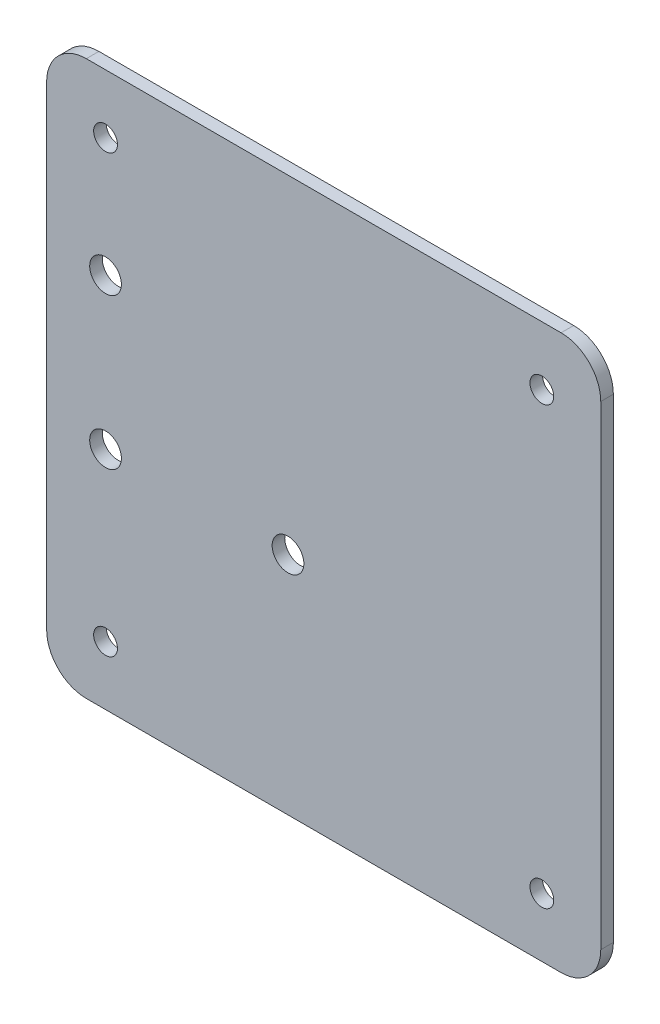
ISO-10303-21;
HEADER;
FILE_DESCRIPTION(('STEP AP214'),'2;1');
FILE_NAME('part.step','',(''),(''),'','','');
FILE_SCHEMA(('AUTOMOTIVE_DESIGN { 1 0 10303 214 1 1 1 1 }'));
ENDSEC;
DATA;
#1=APPLICATION_CONTEXT('core data for automotive mechanical design processes');
#2=APPLICATION_PROTOCOL_DEFINITION('international standard','automotive_design',2000,#1);
#3=PRODUCT_CONTEXT('',#1,'mechanical');
#4=PRODUCT('Part','Part','',(#3));
#5=PRODUCT_RELATED_PRODUCT_CATEGORY('part','',(#4));
#6=PRODUCT_DEFINITION_FORMATION('','',#4);
#7=PRODUCT_DEFINITION_CONTEXT('part definition',#1,'design');
#8=PRODUCT_DEFINITION('design','',#6,#7);
#9=PRODUCT_DEFINITION_SHAPE('','',#8);
#10=(LENGTH_UNIT() NAMED_UNIT(*) SI_UNIT(.MILLI.,.METRE.));
#11=(NAMED_UNIT(*) PLANE_ANGLE_UNIT() SI_UNIT($,.RADIAN.));
#12=(NAMED_UNIT(*) SI_UNIT($,.STERADIAN.) SOLID_ANGLE_UNIT());
#13=UNCERTAINTY_MEASURE_WITH_UNIT(LENGTH_MEASURE(1.E-05),#10,'distance_accuracy_value','');
#14=(GEOMETRIC_REPRESENTATION_CONTEXT(3) GLOBAL_UNCERTAINTY_ASSIGNED_CONTEXT((#13)) GLOBAL_UNIT_ASSIGNED_CONTEXT((#10,
#11,#12)) REPRESENTATION_CONTEXT('',''));
#15=CARTESIAN_POINT('',(0.,0.,0.));
#16=DIRECTION('',(0.,0.,1.));
#17=DIRECTION('',(1.,0.,0.));
#18=AXIS2_PLACEMENT_3D('',#15,#16,#17);
#19=CARTESIAN_POINT('',(66.6352687811831,1591.86,3.175));
#20=DIRECTION('',(0.,0.,-1.));
#21=DIRECTION('',(-1.,0.,0.));
#22=AXIS2_PLACEMENT_3D('',#19,#20,#21);
#23=CYLINDRICAL_SURFACE('',#22,10.);
#24=CARTESIAN_POINT('',(66.6352687811831,1591.86,0.));
#25=DIRECTION('',(0.,0.,1.));
#26=DIRECTION('',(1.,0.,0.));
#27=AXIS2_PLACEMENT_3D('',#24,#25,#26);
#28=CIRCLE('',#27,10.);
#29=CARTESIAN_POINT('',(56.6352687811831,1591.86,0.));
#30=VERTEX_POINT('',#29);
#31=CARTESIAN_POINT('',(66.6352687811831,1581.86,0.));
#32=VERTEX_POINT('',#31);
#33=EDGE_CURVE('E149',#30,#32,#28,.T.);
#34=ORIENTED_EDGE('',*,*,#33,.T.);
#35=DIRECTION('',(0.,0.,-1.));
#36=VECTOR('',#35,1.);
#37=CARTESIAN_POINT('',(66.6352687811831,1581.86,3.175));
#38=LINE('',#37,#36);
#39=CARTESIAN_POINT('',(66.6352687811831,1581.86,3.175));
#40=VERTEX_POINT('',#39);
#41=EDGE_CURVE('E11',#40,#32,#38,.T.);
#42=ORIENTED_EDGE('',*,*,#41,.F.);
#43=CARTESIAN_POINT('',(66.6352687811831,1591.86,3.175));
#44=DIRECTION('',(0.,0.,1.));
#45=DIRECTION('',(1.,0.,0.));
#46=AXIS2_PLACEMENT_3D('',#43,#44,#45);
#47=CIRCLE('',#46,10.);
#48=CARTESIAN_POINT('',(56.6352687811831,1591.86,3.175));
#49=VERTEX_POINT('',#48);
#50=EDGE_CURVE('E170',#49,#40,#47,.T.);
#51=ORIENTED_EDGE('',*,*,#50,.F.);
#52=DIRECTION('',(0.,0.,-1.));
#53=VECTOR('',#52,1.);
#54=CARTESIAN_POINT('',(56.6352687811831,1591.86,3.175));
#55=LINE('',#54,#53);
#56=EDGE_CURVE('E145',#49,#30,#55,.T.);
#57=ORIENTED_EDGE('',*,*,#56,.T.);
#58=EDGE_LOOP('',(#34,#42,#51,#57));
#59=FACE_BOUND('',#58,.T.);
#60=ADVANCED_FACE('F43',(#59),#23,.T.);
#61=CARTESIAN_POINT('',(66.6352687811831,1581.86,3.175));
#62=DIRECTION('',(0.,1.,0.));
#63=DIRECTION('',(0.,0.,1.));
#64=AXIS2_PLACEMENT_3D('',#61,#62,#63);
#65=PLANE('',#64);
#66=DIRECTION('',(1.,0.,0.));
#67=VECTOR('',#66,1.);
#68=CARTESIAN_POINT('',(66.6352687811831,1581.86,0.));
#69=LINE('',#68,#67);
#70=CARTESIAN_POINT('',(186.335268781183,1581.86,0.));
#71=VERTEX_POINT('',#70);
#72=EDGE_CURVE('E152',#32,#71,#69,.T.);
#73=ORIENTED_EDGE('',*,*,#72,.T.);
#74=DIRECTION('',(0.,0.,-1.));
#75=VECTOR('',#74,1.);
#76=CARTESIAN_POINT('',(186.335268781183,1581.86,3.175));
#77=LINE('',#76,#75);
#78=CARTESIAN_POINT('',(186.335268781183,1581.86,3.175));
#79=VERTEX_POINT('',#78);
#80=EDGE_CURVE('E51',#79,#71,#77,.T.);
#81=ORIENTED_EDGE('',*,*,#80,.F.);
#82=DIRECTION('',(1.,0.,0.));
#83=VECTOR('',#82,1.);
#84=CARTESIAN_POINT('',(66.6352687811831,1581.86,3.175));
#85=LINE('',#84,#83);
#86=EDGE_CURVE('E106',#40,#79,#85,.T.);
#87=ORIENTED_EDGE('',*,*,#86,.F.);
#88=ORIENTED_EDGE('',*,*,#41,.T.);
#89=EDGE_LOOP('',(#73,#81,#87,#88));
#90=FACE_BOUND('',#89,.T.);
#91=ADVANCED_FACE('F289',(#90),#65,.F.);
#92=CARTESIAN_POINT('',(186.335268781183,1591.86,3.175));
#93=DIRECTION('',(0.,0.,-1.));
#94=DIRECTION('',(-1.,0.,0.));
#95=AXIS2_PLACEMENT_3D('',#92,#93,#94);
#96=CYLINDRICAL_SURFACE('',#95,10.);
#97=CARTESIAN_POINT('',(186.335268781183,1591.86,0.));
#98=DIRECTION('',(0.,0.,1.));
#99=DIRECTION('',(1.,0.,0.));
#100=AXIS2_PLACEMENT_3D('',#97,#98,#99);
#101=CIRCLE('',#100,10.);
#102=CARTESIAN_POINT('',(196.335268781183,1591.86,0.));
#103=VERTEX_POINT('',#102);
#104=EDGE_CURVE('E156',#71,#103,#101,.T.);
#105=ORIENTED_EDGE('',*,*,#104,.T.);
#106=DIRECTION('',(0.,0.,-1.));
#107=VECTOR('',#106,1.);
#108=CARTESIAN_POINT('',(196.335268781183,1591.86,3.175));
#109=LINE('',#108,#107);
#110=CARTESIAN_POINT('',(196.335268781183,1591.86,3.175));
#111=VERTEX_POINT('',#110);
#112=EDGE_CURVE('E179',#111,#103,#109,.T.);
#113=ORIENTED_EDGE('',*,*,#112,.F.);
#114=CARTESIAN_POINT('',(186.335268781183,1591.86,3.175));
#115=DIRECTION('',(0.,0.,1.));
#116=DIRECTION('',(1.,0.,0.));
#117=AXIS2_PLACEMENT_3D('',#114,#115,#116);
#118=CIRCLE('',#117,10.);
#119=EDGE_CURVE('E190',#79,#111,#118,.T.);
#120=ORIENTED_EDGE('',*,*,#119,.F.);
#121=ORIENTED_EDGE('',*,*,#80,.T.);
#122=EDGE_LOOP('',(#105,#113,#120,#121));
#123=FACE_BOUND('',#122,.T.);
#124=ADVANCED_FACE('F188',(#123),#96,.T.);
#125=CARTESIAN_POINT('',(196.335268781183,1711.56,3.175));
#126=DIRECTION('',(-1.,0.,0.));
#127=DIRECTION('',(0.,-1.,0.));
#128=AXIS2_PLACEMENT_3D('',#125,#126,#127);
#129=PLANE('',#128);
#130=DIRECTION('',(0.,1.,0.));
#131=VECTOR('',#130,1.);
#132=CARTESIAN_POINT('',(196.335268781183,1711.56,0.));
#133=LINE('',#132,#131);
#134=CARTESIAN_POINT('',(196.335268781183,1711.56,0.));
#135=VERTEX_POINT('',#134);
#136=EDGE_CURVE('E159',#103,#135,#133,.T.);
#137=ORIENTED_EDGE('',*,*,#136,.T.);
#138=DIRECTION('',(0.,0.,-1.));
#139=VECTOR('',#138,1.);
#140=CARTESIAN_POINT('',(196.335268781183,1711.56,3.175));
#141=LINE('',#140,#139);
#142=CARTESIAN_POINT('',(196.335268781183,1711.56,3.175));
#143=VERTEX_POINT('',#142);
#144=EDGE_CURVE('E175',#143,#135,#141,.T.);
#145=ORIENTED_EDGE('',*,*,#144,.F.);
#146=DIRECTION('',(0.,1.,0.));
#147=VECTOR('',#146,1.);
#148=CARTESIAN_POINT('',(196.335268781183,1711.56,3.175));
#149=LINE('',#148,#147);
#150=EDGE_CURVE('E203',#111,#143,#149,.T.);
#151=ORIENTED_EDGE('',*,*,#150,.F.);
#152=ORIENTED_EDGE('',*,*,#112,.T.);
#153=EDGE_LOOP('',(#137,#145,#151,#152));
#154=FACE_BOUND('',#153,.T.);
#155=ADVANCED_FACE('F198',(#154),#129,.F.);
#156=CARTESIAN_POINT('',(186.335268781183,1711.56,3.175));
#157=DIRECTION('',(0.,0.,-1.));
#158=DIRECTION('',(-1.,0.,0.));
#159=AXIS2_PLACEMENT_3D('',#156,#157,#158);
#160=CYLINDRICAL_SURFACE('',#159,10.);
#161=CARTESIAN_POINT('',(186.335268781183,1711.56,0.));
#162=DIRECTION('',(0.,0.,1.));
#163=DIRECTION('',(-1.,0.,0.));
#164=AXIS2_PLACEMENT_3D('',#161,#162,#163);
#165=CIRCLE('',#164,10.);
#166=CARTESIAN_POINT('',(186.335268781183,1721.56,0.));
#167=VERTEX_POINT('',#166);
#168=EDGE_CURVE('E162',#135,#167,#165,.T.);
#169=ORIENTED_EDGE('',*,*,#168,.T.);
#170=DIRECTION('',(0.,0.,-1.));
#171=VECTOR('',#170,1.);
#172=CARTESIAN_POINT('',(186.335268781183,1721.56,3.175));
#173=LINE('',#172,#171);
#174=CARTESIAN_POINT('',(186.335268781183,1721.56,3.175));
#175=VERTEX_POINT('',#174);
#176=EDGE_CURVE('E139',#175,#167,#173,.T.);
#177=ORIENTED_EDGE('',*,*,#176,.F.);
#178=CARTESIAN_POINT('',(186.335268781183,1711.56,3.175));
#179=DIRECTION('',(0.,0.,1.));
#180=DIRECTION('',(-1.,0.,0.));
#181=AXIS2_PLACEMENT_3D('',#178,#179,#180);
#182=CIRCLE('',#181,10.);
#183=EDGE_CURVE('E129',#143,#175,#182,.T.);
#184=ORIENTED_EDGE('',*,*,#183,.F.);
#185=ORIENTED_EDGE('',*,*,#144,.T.);
#186=EDGE_LOOP('',(#169,#177,#184,#185));
#187=FACE_BOUND('',#186,.T.);
#188=ADVANCED_FACE('F201',(#187),#160,.T.);
#189=CARTESIAN_POINT('',(66.6352687811831,1721.56,3.175));
#190=DIRECTION('',(0.,-1.,0.));
#191=DIRECTION('',(0.,0.,-1.));
#192=AXIS2_PLACEMENT_3D('',#189,#190,#191);
#193=PLANE('',#192);
#194=DIRECTION('',(-1.,0.,0.));
#195=VECTOR('',#194,1.);
#196=CARTESIAN_POINT('',(66.6352687811831,1721.56,0.));
#197=LINE('',#196,#195);
#198=CARTESIAN_POINT('',(66.6352687811831,1721.56,0.));
#199=VERTEX_POINT('',#198);
#200=EDGE_CURVE('E138',#167,#199,#197,.T.);
#201=ORIENTED_EDGE('',*,*,#200,.T.);
#202=DIRECTION('',(0.,0.,-1.));
#203=VECTOR('',#202,1.);
#204=CARTESIAN_POINT('',(66.6352687811831,1721.56,3.175));
#205=LINE('',#204,#203);
#206=CARTESIAN_POINT('',(66.6352687811831,1721.56,3.175));
#207=VERTEX_POINT('',#206);
#208=EDGE_CURVE('E135',#207,#199,#205,.T.);
#209=ORIENTED_EDGE('',*,*,#208,.F.);
#210=DIRECTION('',(-1.,0.,0.));
#211=VECTOR('',#210,1.);
#212=CARTESIAN_POINT('',(66.6352687811831,1721.56,3.175));
#213=LINE('',#212,#211);
#214=EDGE_CURVE('E123',#175,#207,#213,.T.);
#215=ORIENTED_EDGE('',*,*,#214,.F.);
#216=ORIENTED_EDGE('',*,*,#176,.T.);
#217=EDGE_LOOP('',(#201,#209,#215,#216));
#218=FACE_BOUND('',#217,.T.);
#219=ADVANCED_FACE('F136',(#218),#193,.F.);
#220=CARTESIAN_POINT('',(66.6352687811831,1711.56,3.175));
#221=DIRECTION('',(0.,0.,-1.));
#222=DIRECTION('',(-1.,0.,0.));
#223=AXIS2_PLACEMENT_3D('',#220,#221,#222);
#224=CYLINDRICAL_SURFACE('',#223,9.99999999999999);
#225=CARTESIAN_POINT('',(66.6352687811831,1711.56,0.));
#226=DIRECTION('',(0.,0.,1.));
#227=DIRECTION('',(1.,0.,0.));
#228=AXIS2_PLACEMENT_3D('',#225,#226,#227);
#229=CIRCLE('',#228,9.99999999999999);
#230=CARTESIAN_POINT('',(56.6352687811831,1711.56,0.));
#231=VERTEX_POINT('',#230);
#232=EDGE_CURVE('E92',#199,#231,#229,.T.);
#233=ORIENTED_EDGE('',*,*,#232,.T.);
#234=DIRECTION('',(0.,0.,-1.));
#235=VECTOR('',#234,1.);
#236=CARTESIAN_POINT('',(56.6352687811831,1711.56,3.175));
#237=LINE('',#236,#235);
#238=CARTESIAN_POINT('',(56.6352687811831,1711.56,3.175));
#239=VERTEX_POINT('',#238);
#240=EDGE_CURVE('E140',#239,#231,#237,.T.);
#241=ORIENTED_EDGE('',*,*,#240,.F.);
#242=CARTESIAN_POINT('',(66.6352687811831,1711.56,3.175));
#243=DIRECTION('',(0.,0.,1.));
#244=DIRECTION('',(1.,0.,0.));
#245=AXIS2_PLACEMENT_3D('',#242,#243,#244);
#246=CIRCLE('',#245,9.99999999999999);
#247=EDGE_CURVE('E127',#207,#239,#246,.T.);
#248=ORIENTED_EDGE('',*,*,#247,.F.);
#249=ORIENTED_EDGE('',*,*,#208,.T.);
#250=EDGE_LOOP('',(#233,#241,#248,#249));
#251=FACE_BOUND('',#250,.T.);
#252=ADVANCED_FACE('F142',(#251),#224,.T.);
#253=CARTESIAN_POINT('',(56.6352687811831,1711.56,3.175));
#254=DIRECTION('',(1.,0.,0.));
#255=DIRECTION('',(0.,1.,0.));
#256=AXIS2_PLACEMENT_3D('',#253,#254,#255);
#257=PLANE('',#256);
#258=DIRECTION('',(0.,-1.,0.));
#259=VECTOR('',#258,1.);
#260=CARTESIAN_POINT('',(56.6352687811831,1711.56,0.));
#261=LINE('',#260,#259);
#262=EDGE_CURVE('E98',#231,#30,#261,.T.);
#263=ORIENTED_EDGE('',*,*,#262,.T.);
#264=ORIENTED_EDGE('',*,*,#56,.F.);
#265=DIRECTION('',(0.,-1.,0.));
#266=VECTOR('',#265,1.);
#267=CARTESIAN_POINT('',(56.6352687811831,1711.56,3.175));
#268=LINE('',#267,#266);
#269=EDGE_CURVE('E59',#239,#49,#268,.T.);
#270=ORIENTED_EDGE('',*,*,#269,.F.);
#271=ORIENTED_EDGE('',*,*,#240,.T.);
#272=EDGE_LOOP('',(#263,#264,#270,#271));
#273=FACE_BOUND('',#272,.T.);
#274=ADVANCED_FACE('F296',(#273),#257,.F.);
#275=CARTESIAN_POINT('',(66.6352687811831,1591.86,3.175));
#276=DIRECTION('',(0.,0.,1.));
#277=DIRECTION('',(1.,0.,0.));
#278=AXIS2_PLACEMENT_3D('',#275,#276,#277);
#279=PLANE('',#278);
#280=CARTESIAN_POINT('',(181.485268781183,1706.71,3.175));
#281=DIRECTION('',(0.,0.,-1.));
#282=DIRECTION('',(-1.,0.,0.));
#283=AXIS2_PLACEMENT_3D('',#280,#281,#282);
#284=CIRCLE('',#283,2.99999999999999);
#285=CARTESIAN_POINT('',(178.485268781183,1706.71,3.175));
#286=VERTEX_POINT('',#285);
#287=EDGE_CURVE('E242',#286,#286,#284,.T.);
#288=ORIENTED_EDGE('',*,*,#287,.T.);
#289=EDGE_LOOP('',(#288));
#290=FACE_BOUND('',#289,.T.);
#291=CARTESIAN_POINT('',(181.485268781183,1596.71,3.175));
#292=DIRECTION('',(0.,0.,-1.));
#293=DIRECTION('',(-1.,0.,0.));
#294=AXIS2_PLACEMENT_3D('',#291,#292,#293);
#295=CIRCLE('',#294,2.99999999999999);
#296=CARTESIAN_POINT('',(178.485268781183,1596.71,3.175));
#297=VERTEX_POINT('',#296);
#298=EDGE_CURVE('E235',#297,#297,#295,.T.);
#299=ORIENTED_EDGE('',*,*,#298,.T.);
#300=EDGE_LOOP('',(#299));
#301=FACE_BOUND('',#300,.T.);
#302=CARTESIAN_POINT('',(71.4852687811831,1596.71,3.175));
#303=DIRECTION('',(0.,0.,-1.));
#304=DIRECTION('',(-1.,0.,0.));
#305=AXIS2_PLACEMENT_3D('',#302,#303,#304);
#306=CIRCLE('',#305,3.00000000000001);
#307=CARTESIAN_POINT('',(68.4852687811831,1596.71,3.175));
#308=VERTEX_POINT('',#307);
#309=EDGE_CURVE('E227',#308,#308,#306,.T.);
#310=ORIENTED_EDGE('',*,*,#309,.T.);
#311=EDGE_LOOP('',(#310));
#312=FACE_BOUND('',#311,.T.);
#313=CARTESIAN_POINT('',(71.4852687811831,1638.71,3.175));
#314=DIRECTION('',(0.,0.,-1.));
#315=DIRECTION('',(-1.,0.,0.));
#316=AXIS2_PLACEMENT_3D('',#313,#314,#315);
#317=CIRCLE('',#316,4.00000000000001);
#318=CARTESIAN_POINT('',(67.4852687811831,1638.71,3.175));
#319=VERTEX_POINT('',#318);
#320=EDGE_CURVE('E218',#319,#319,#317,.T.);
#321=ORIENTED_EDGE('',*,*,#320,.T.);
#322=EDGE_LOOP('',(#321));
#323=FACE_BOUND('',#322,.T.);
#324=CARTESIAN_POINT('',(71.4852687811831,1676.71,3.175));
#325=DIRECTION('',(0.,0.,-1.));
#326=DIRECTION('',(-1.,0.,0.));
#327=AXIS2_PLACEMENT_3D('',#324,#325,#326);
#328=CIRCLE('',#327,4.00000000000001);
#329=CARTESIAN_POINT('',(67.4852687811831,1676.71,3.175));
#330=VERTEX_POINT('',#329);
#331=EDGE_CURVE('E257',#330,#330,#328,.T.);
#332=ORIENTED_EDGE('',*,*,#331,.T.);
#333=EDGE_LOOP('',(#332));
#334=FACE_BOUND('',#333,.T.);
#335=CARTESIAN_POINT('',(117.485268781183,1638.71,3.175));
#336=DIRECTION('',(0.,0.,-1.));
#337=DIRECTION('',(-1.,0.,0.));
#338=AXIS2_PLACEMENT_3D('',#335,#336,#337);
#339=CIRCLE('',#338,4.00000000000001);
#340=CARTESIAN_POINT('',(113.485268781183,1638.71,3.175));
#341=VERTEX_POINT('',#340);
#342=EDGE_CURVE('E249',#341,#341,#339,.T.);
#343=ORIENTED_EDGE('',*,*,#342,.T.);
#344=EDGE_LOOP('',(#343));
#345=FACE_BOUND('',#344,.T.);
#346=CARTESIAN_POINT('',(71.4852687811831,1706.71,3.175));
#347=DIRECTION('',(0.,0.,-1.));
#348=DIRECTION('',(-1.,0.,0.));
#349=AXIS2_PLACEMENT_3D('',#346,#347,#348);
#350=CIRCLE('',#349,3.00000000000001);
#351=CARTESIAN_POINT('',(68.4852687811831,1706.71,3.175));
#352=VERTEX_POINT('',#351);
#353=EDGE_CURVE('E153',#352,#352,#350,.T.);
#354=ORIENTED_EDGE('',*,*,#353,.T.);
#355=EDGE_LOOP('',(#354));
#356=FACE_BOUND('',#355,.T.);
#357=ORIENTED_EDGE('',*,*,#50,.T.);
#358=ORIENTED_EDGE('',*,*,#86,.T.);
#359=ORIENTED_EDGE('',*,*,#119,.T.);
#360=ORIENTED_EDGE('',*,*,#150,.T.);
#361=ORIENTED_EDGE('',*,*,#183,.T.);
#362=ORIENTED_EDGE('',*,*,#214,.T.);
#363=ORIENTED_EDGE('',*,*,#247,.T.);
#364=ORIENTED_EDGE('',*,*,#269,.T.);
#365=EDGE_LOOP('',(#357,#358,#359,#360,#361,#362,#363,#364));
#366=FACE_BOUND('',#365,.T.);
#367=ADVANCED_FACE('F125',(#290,#301,#312,#323,#334,#345,#356,#366),#279,.T.);
#368=CARTESIAN_POINT('',(66.6352687811831,1591.86,0.));
#369=DIRECTION('',(0.,0.,1.));
#370=DIRECTION('',(1.,0.,0.));
#371=AXIS2_PLACEMENT_3D('',#368,#369,#370);
#372=PLANE('',#371);
#373=CARTESIAN_POINT('',(181.485268781183,1706.71,0.));
#374=DIRECTION('',(0.,0.,-1.));
#375=DIRECTION('',(-1.,0.,0.));
#376=AXIS2_PLACEMENT_3D('',#373,#374,#375);
#377=CIRCLE('',#376,2.99999999999999);
#378=CARTESIAN_POINT('',(178.485268781183,1706.71,0.));
#379=VERTEX_POINT('',#378);
#380=EDGE_CURVE('E215',#379,#379,#377,.T.);
#381=ORIENTED_EDGE('',*,*,#380,.F.);
#382=EDGE_LOOP('',(#381));
#383=FACE_BOUND('',#382,.T.);
#384=CARTESIAN_POINT('',(181.485268781183,1596.71,0.));
#385=DIRECTION('',(0.,0.,-1.));
#386=DIRECTION('',(-1.,0.,0.));
#387=AXIS2_PLACEMENT_3D('',#384,#385,#386);
#388=CIRCLE('',#387,2.99999999999999);
#389=CARTESIAN_POINT('',(178.485268781183,1596.71,0.));
#390=VERTEX_POINT('',#389);
#391=EDGE_CURVE('E239',#390,#390,#388,.T.);
#392=ORIENTED_EDGE('',*,*,#391,.F.);
#393=EDGE_LOOP('',(#392));
#394=FACE_BOUND('',#393,.T.);
#395=CARTESIAN_POINT('',(71.4852687811831,1596.71,0.));
#396=DIRECTION('',(0.,0.,-1.));
#397=DIRECTION('',(-1.,0.,0.));
#398=AXIS2_PLACEMENT_3D('',#395,#396,#397);
#399=CIRCLE('',#398,3.00000000000001);
#400=CARTESIAN_POINT('',(68.4852687811831,1596.71,0.));
#401=VERTEX_POINT('',#400);
#402=EDGE_CURVE('E231',#401,#401,#399,.T.);
#403=ORIENTED_EDGE('',*,*,#402,.F.);
#404=EDGE_LOOP('',(#403));
#405=FACE_BOUND('',#404,.T.);
#406=CARTESIAN_POINT('',(71.4852687811831,1638.71,0.));
#407=DIRECTION('',(0.,0.,-1.));
#408=DIRECTION('',(-1.,0.,0.));
#409=AXIS2_PLACEMENT_3D('',#406,#407,#408);
#410=CIRCLE('',#409,4.00000000000001);
#411=CARTESIAN_POINT('',(67.4852687811831,1638.71,0.));
#412=VERTEX_POINT('',#411);
#413=EDGE_CURVE('E222',#412,#412,#410,.T.);
#414=ORIENTED_EDGE('',*,*,#413,.F.);
#415=EDGE_LOOP('',(#414));
#416=FACE_BOUND('',#415,.T.);
#417=CARTESIAN_POINT('',(71.4852687811831,1676.71,0.));
#418=DIRECTION('',(0.,0.,-1.));
#419=DIRECTION('',(-1.,0.,0.));
#420=AXIS2_PLACEMENT_3D('',#417,#418,#419);
#421=CIRCLE('',#420,4.00000000000001);
#422=CARTESIAN_POINT('',(67.4852687811831,1676.71,0.));
#423=VERTEX_POINT('',#422);
#424=EDGE_CURVE('E223',#423,#423,#421,.T.);
#425=ORIENTED_EDGE('',*,*,#424,.F.);
#426=EDGE_LOOP('',(#425));
#427=FACE_BOUND('',#426,.T.);
#428=CARTESIAN_POINT('',(117.485268781183,1638.71,0.));
#429=DIRECTION('',(0.,0.,-1.));
#430=DIRECTION('',(-1.,0.,0.));
#431=AXIS2_PLACEMENT_3D('',#428,#429,#430);
#432=CIRCLE('',#431,4.00000000000001);
#433=CARTESIAN_POINT('',(113.485268781183,1638.71,0.));
#434=VERTEX_POINT('',#433);
#435=EDGE_CURVE('E253',#434,#434,#432,.T.);
#436=ORIENTED_EDGE('',*,*,#435,.F.);
#437=EDGE_LOOP('',(#436));
#438=FACE_BOUND('',#437,.T.);
#439=CARTESIAN_POINT('',(71.4852687811831,1706.71,0.));
#440=DIRECTION('',(0.,0.,-1.));
#441=DIRECTION('',(-1.,0.,0.));
#442=AXIS2_PLACEMENT_3D('',#439,#440,#441);
#443=CIRCLE('',#442,3.00000000000001);
#444=CARTESIAN_POINT('',(68.4852687811831,1706.71,0.));
#445=VERTEX_POINT('',#444);
#446=EDGE_CURVE('E212',#445,#445,#443,.T.);
#447=ORIENTED_EDGE('',*,*,#446,.F.);
#448=EDGE_LOOP('',(#447));
#449=FACE_BOUND('',#448,.T.);
#450=ORIENTED_EDGE('',*,*,#33,.F.);
#451=ORIENTED_EDGE('',*,*,#262,.F.);
#452=ORIENTED_EDGE('',*,*,#232,.F.);
#453=ORIENTED_EDGE('',*,*,#200,.F.);
#454=ORIENTED_EDGE('',*,*,#168,.F.);
#455=ORIENTED_EDGE('',*,*,#136,.F.);
#456=ORIENTED_EDGE('',*,*,#104,.F.);
#457=ORIENTED_EDGE('',*,*,#72,.F.);
#458=EDGE_LOOP('',(#450,#451,#452,#453,#454,#455,#456,#457));
#459=FACE_BOUND('',#458,.T.);
#460=ADVANCED_FACE('F194',(#383,#394,#405,#416,#427,#438,#449,#459),#372,.F.);
#461=CARTESIAN_POINT('',(71.4852687811831,1706.71,3.175));
#462=DIRECTION('',(0.,0.,-1.));
#463=DIRECTION('',(-1.,0.,0.));
#464=AXIS2_PLACEMENT_3D('',#461,#462,#463);
#465=CYLINDRICAL_SURFACE('',#464,3.00000000000001);
#466=ORIENTED_EDGE('',*,*,#353,.F.);
#467=EDGE_LOOP('',(#466));
#468=FACE_BOUND('',#467,.T.);
#469=ORIENTED_EDGE('',*,*,#446,.T.);
#470=EDGE_LOOP('',(#469));
#471=FACE_BOUND('',#470,.T.);
#472=ADVANCED_FACE('F269',(#468,#471),#465,.F.);
#473=CARTESIAN_POINT('',(117.485268781183,1638.71,3.175));
#474=DIRECTION('',(0.,0.,-1.));
#475=DIRECTION('',(-1.,0.,0.));
#476=AXIS2_PLACEMENT_3D('',#473,#474,#475);
#477=CYLINDRICAL_SURFACE('',#476,4.00000000000001);
#478=ORIENTED_EDGE('',*,*,#342,.F.);
#479=EDGE_LOOP('',(#478));
#480=FACE_BOUND('',#479,.T.);
#481=ORIENTED_EDGE('',*,*,#435,.T.);
#482=EDGE_LOOP('',(#481));
#483=FACE_BOUND('',#482,.T.);
#484=ADVANCED_FACE('F277',(#480,#483),#477,.F.);
#485=CARTESIAN_POINT('',(71.4852687811831,1676.71,3.175));
#486=DIRECTION('',(0.,0.,-1.));
#487=DIRECTION('',(-1.,0.,0.));
#488=AXIS2_PLACEMENT_3D('',#485,#486,#487);
#489=CYLINDRICAL_SURFACE('',#488,4.00000000000001);
#490=ORIENTED_EDGE('',*,*,#331,.F.);
#491=EDGE_LOOP('',(#490));
#492=FACE_BOUND('',#491,.T.);
#493=ORIENTED_EDGE('',*,*,#424,.T.);
#494=EDGE_LOOP('',(#493));
#495=FACE_BOUND('',#494,.T.);
#496=ADVANCED_FACE('F265',(#492,#495),#489,.F.);
#497=CARTESIAN_POINT('',(71.4852687811831,1638.71,3.175));
#498=DIRECTION('',(0.,0.,-1.));
#499=DIRECTION('',(-1.,0.,0.));
#500=AXIS2_PLACEMENT_3D('',#497,#498,#499);
#501=CYLINDRICAL_SURFACE('',#500,4.00000000000001);
#502=ORIENTED_EDGE('',*,*,#320,.F.);
#503=EDGE_LOOP('',(#502));
#504=FACE_BOUND('',#503,.T.);
#505=ORIENTED_EDGE('',*,*,#413,.T.);
#506=EDGE_LOOP('',(#505));
#507=FACE_BOUND('',#506,.T.);
#508=ADVANCED_FACE('F373',(#504,#507),#501,.F.);
#509=CARTESIAN_POINT('',(71.4852687811831,1596.71,3.175));
#510=DIRECTION('',(0.,0.,-1.));
#511=DIRECTION('',(-1.,0.,0.));
#512=AXIS2_PLACEMENT_3D('',#509,#510,#511);
#513=CYLINDRICAL_SURFACE('',#512,3.00000000000001);
#514=ORIENTED_EDGE('',*,*,#309,.F.);
#515=EDGE_LOOP('',(#514));
#516=FACE_BOUND('',#515,.T.);
#517=ORIENTED_EDGE('',*,*,#402,.T.);
#518=EDGE_LOOP('',(#517));
#519=FACE_BOUND('',#518,.T.);
#520=ADVANCED_FACE('F383',(#516,#519),#513,.F.);
#521=CARTESIAN_POINT('',(181.485268781183,1596.71,3.175));
#522=DIRECTION('',(0.,0.,-1.));
#523=DIRECTION('',(-1.,0.,0.));
#524=AXIS2_PLACEMENT_3D('',#521,#522,#523);
#525=CYLINDRICAL_SURFACE('',#524,2.99999999999999);
#526=ORIENTED_EDGE('',*,*,#298,.F.);
#527=EDGE_LOOP('',(#526));
#528=FACE_BOUND('',#527,.T.);
#529=ORIENTED_EDGE('',*,*,#391,.T.);
#530=EDGE_LOOP('',(#529));
#531=FACE_BOUND('',#530,.T.);
#532=ADVANCED_FACE('F392',(#528,#531),#525,.F.);
#533=CARTESIAN_POINT('',(181.485268781183,1706.71,3.175));
#534=DIRECTION('',(0.,0.,-1.));
#535=DIRECTION('',(-1.,0.,0.));
#536=AXIS2_PLACEMENT_3D('',#533,#534,#535);
#537=CYLINDRICAL_SURFACE('',#536,2.99999999999999);
#538=ORIENTED_EDGE('',*,*,#287,.F.);
#539=EDGE_LOOP('',(#538));
#540=FACE_BOUND('',#539,.T.);
#541=ORIENTED_EDGE('',*,*,#380,.T.);
#542=EDGE_LOOP('',(#541));
#543=FACE_BOUND('',#542,.T.);
#544=ADVANCED_FACE('F402',(#540,#543),#537,.F.);
#545=CLOSED_SHELL('',(#60,#91,#124,#155,#188,#219,#252,#274,#367,#460,#472,#484,#496,#508,#520,
#532,#544));
#546=MANIFOLD_SOLID_BREP('B2',#545);
#547=ADVANCED_BREP_SHAPE_REPRESENTATION('',(#18,#546),#14);
#548=SHAPE_DEFINITION_REPRESENTATION(#9,#547);
ENDSEC;
END-ISO-10303-21;
